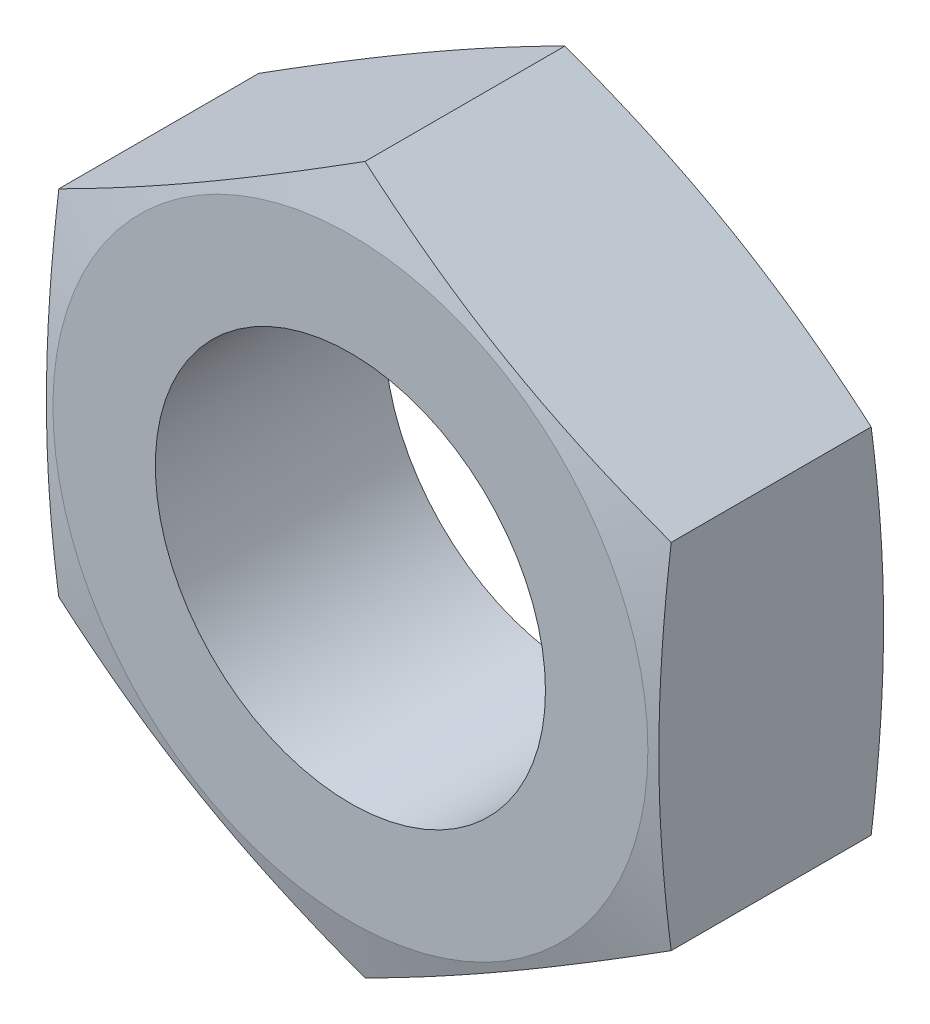
ISO-10303-21;
HEADER;
FILE_DESCRIPTION(('STEP AP214'),'2;1');
FILE_NAME('part.step','',(''),(''),'','','');
FILE_SCHEMA(('AUTOMOTIVE_DESIGN { 1 0 10303 214 1 1 1 1 }'));
ENDSEC;
DATA;
#1=APPLICATION_CONTEXT('core data for automotive mechanical design processes');
#2=APPLICATION_PROTOCOL_DEFINITION('international standard','automotive_design',2000,#1);
#3=PRODUCT_CONTEXT('',#1,'mechanical');
#4=PRODUCT('Part','Part','',(#3));
#5=PRODUCT_RELATED_PRODUCT_CATEGORY('part','',(#4));
#6=PRODUCT_DEFINITION_FORMATION('','',#4);
#7=PRODUCT_DEFINITION_CONTEXT('part definition',#1,'design');
#8=PRODUCT_DEFINITION('design','',#6,#7);
#9=PRODUCT_DEFINITION_SHAPE('','',#8);
#10=(LENGTH_UNIT() NAMED_UNIT(*) SI_UNIT(.MILLI.,.METRE.));
#11=(NAMED_UNIT(*) PLANE_ANGLE_UNIT() SI_UNIT($,.RADIAN.));
#12=(NAMED_UNIT(*) SI_UNIT($,.STERADIAN.) SOLID_ANGLE_UNIT());
#13=UNCERTAINTY_MEASURE_WITH_UNIT(LENGTH_MEASURE(1.E-05),#10,'distance_accuracy_value','');
#14=(GEOMETRIC_REPRESENTATION_CONTEXT(3) GLOBAL_UNCERTAINTY_ASSIGNED_CONTEXT((#13)) GLOBAL_UNIT_ASSIGNED_CONTEXT((#10,
#11,#12)) REPRESENTATION_CONTEXT('',''));
#15=CARTESIAN_POINT('',(0.,0.,0.));
#16=DIRECTION('',(0.,0.,1.));
#17=DIRECTION('',(1.,0.,0.));
#18=AXIS2_PLACEMENT_3D('',#15,#16,#17);
#19=CARTESIAN_POINT('',(0.,0.,-0.3));
#20=DIRECTION('',(0.,0.,-1.));
#21=DIRECTION('',(-1.,0.,0.));
#22=AXIS2_PLACEMENT_3D('',#19,#20,#21);
#23=CONICAL_SURFACE('',#22,7.25,1.31561393617408);
#24=CARTESIAN_POINT('',(0.,0.,0.));
#25=DIRECTION('',(0.,0.,1.));
#26=DIRECTION('',(1.,0.,0.));
#27=AXIS2_PLACEMENT_3D('',#24,#25,#26);
#28=CIRCLE('',#27,6.1);
#29=CARTESIAN_POINT('',(6.1,0.,0.));
#30=VERTEX_POINT('',#29);
#31=EDGE_CURVE('E214',#30,#30,#28,.T.);
#32=ORIENTED_EDGE('',*,*,#31,.F.);
#33=EDGE_LOOP('',(#32));
#34=FACE_BOUND('',#33,.T.);
#35=CARTESIAN_POINT('',(-0.0002,7.25011547005384,-0.300030123342369));
#36=CARTESIAN_POINT('',(0.260599655821666,7.09954271856064,-0.26073342817));
#37=CARTESIAN_POINT('',(0.521847916113624,6.94871096515576,-0.225062996490111));
#38=CARTESIAN_POINT('',(1.04521907229337,6.6465424872493,-0.162398748457734));
#39=CARTESIAN_POINT('',(1.30734226508088,6.49520559133259,-0.135408263534045));
#40=CARTESIAN_POINT('',(1.83095613749682,6.19289698114183,-0.0916676265620827));
#41=CARTESIAN_POINT('',(2.09244363443016,6.04192710439764,-0.0748680045735744));
#42=CARTESIAN_POINT('',(2.61573482819259,5.73980479281435,-0.0523418352924317));
#43=CARTESIAN_POINT('',(2.87753845845558,5.58865239640719,-0.0466132636792695));
#44=CARTESIAN_POINT('',(3.40114571898156,5.28634760359288,-0.0466132636792696));
#45=CARTESIAN_POINT('',(3.66294934924455,5.13519520718572,-0.0523418352924318));
#46=CARTESIAN_POINT('',(4.18624054300698,4.83307289560243,-0.0748680045735745));
#47=CARTESIAN_POINT('',(4.44772803994032,4.68210301885824,-0.0916676265620826));
#48=CARTESIAN_POINT('',(4.97134191235626,4.37979440866748,-0.135408263534045));
#49=CARTESIAN_POINT('',(5.23346510514377,4.22845751275077,-0.162398748457734));
#50=CARTESIAN_POINT('',(5.75683626132351,3.92628903484431,-0.225062996490111));
#51=CARTESIAN_POINT('',(6.01808452161547,3.77545728143943,-0.26073342817));
#52=CARTESIAN_POINT('',(6.27888417743714,3.62488452994623,-0.300030123342369));
#53=B_SPLINE_CURVE_WITH_KNOTS('',3,(#35,#36,#37,#38,#39,#40,#41,#42,#43,#44,#45,#46,#47,#48,#49,
#50,#51,#52),.UNSPECIFIED.,.F.,.F.,(4,2,2,2,2,2,2,2,4),(0.,0.911140879061937,1.82263104463789,
2.7296603584656,3.63652380800932,4.54338725755305,5.45041657138076,6.36190673695671,
7.27304761601864),.UNSPECIFIED.);
#54=CARTESIAN_POINT('',(0.,7.25,-0.3));
#55=VERTEX_POINT('',#54);
#56=CARTESIAN_POINT('',(6.27868417743714,3.62500000000007,-0.3));
#57=VERTEX_POINT('',#56);
#58=EDGE_CURVE('E163',#55,#57,#53,.T.);
#59=ORIENTED_EDGE('',*,*,#58,.F.);
#60=CARTESIAN_POINT('',(-6.27888417743719,3.62488452994615,-0.300030123342369));
#61=CARTESIAN_POINT('',(-6.01808452161552,3.77545728143935,-0.260733428169999));
#62=CARTESIAN_POINT('',(-5.75683626132356,3.92628903484423,-0.225062996490109));
#63=CARTESIAN_POINT('',(-5.23346510514381,4.2284575127507,-0.16239874845773));
#64=CARTESIAN_POINT('',(-4.97134191235629,4.37979440866741,-0.135408263534041));
#65=CARTESIAN_POINT('',(-4.44772803994035,4.68210301885818,-0.0916676265620771));
#66=CARTESIAN_POINT('',(-4.18624054300701,4.83307289560237,-0.0748680045735684));
#67=CARTESIAN_POINT('',(-3.66294934924458,5.13519520718567,-0.0523418352924252));
#68=CARTESIAN_POINT('',(-3.40114571898159,5.28634760359283,-0.0466132636792629));
#69=CARTESIAN_POINT('',(-2.8775384584556,5.58865239640715,-0.0466132636792629));
#70=CARTESIAN_POINT('',(-2.61573482819261,5.73980479281431,-0.0523418352924252));
#71=CARTESIAN_POINT('',(-2.09244363443018,6.04192710439761,-0.0748680045735685));
#72=CARTESIAN_POINT('',(-1.83095613749684,6.1928969811418,-0.0916676265620773));
#73=CARTESIAN_POINT('',(-1.30734226508089,6.49520559133257,-0.135408263534041));
#74=CARTESIAN_POINT('',(-1.04521907229338,6.64654248724928,-0.16239874845773));
#75=CARTESIAN_POINT('',(-0.521847916113628,6.94871096515575,-0.225062996490109));
#76=CARTESIAN_POINT('',(-0.260599655821667,7.09954271856064,-0.260733428169999));
#77=CARTESIAN_POINT('',(0.0002000000000007,7.25011547005384,-0.300030123342369));
#78=B_SPLINE_CURVE_WITH_KNOTS('',3,(#60,#61,#62,#63,#64,#65,#66,#67,#68,#69,#70,#71,#72,#73,#74,
#75,#76,#77),.UNSPECIFIED.,.F.,.F.,(4,2,2,2,2,2,2,2,4),(0.,0.911140879061948,1.82263104463791,
2.72966035846563,3.63652380800937,4.5433872575531,5.45041657138082,6.36190673695678,
7.27304761601873),.UNSPECIFIED.);
#79=CARTESIAN_POINT('',(-6.27868417743719,3.62499999999999,-0.3));
#80=VERTEX_POINT('',#79);
#81=EDGE_CURVE('E183',#80,#55,#78,.T.);
#82=ORIENTED_EDGE('',*,*,#81,.F.);
#83=CARTESIAN_POINT('',(-6.27868417743714,-9.57968471449994,-1.39667422304502));
#84=CARTESIAN_POINT('',(-6.27868417743714,-9.29492049546667,-1.33456023328671));
#85=CARTESIAN_POINT('',(-6.27868417743714,-9.00998673211827,-1.27320960556697));
#86=CARTESIAN_POINT('',(-6.27868417743715,-8.43969704656944,-1.15244637753268));
#87=CARTESIAN_POINT('',(-6.27868417743715,-8.15434110748845,-1.09303385702891));
#88=CARTESIAN_POINT('',(-6.27868417743715,-7.58288068713854,-0.976508936932167));
#89=CARTESIAN_POINT('',(-6.27868417743715,-7.2967757556802,-0.919398737290497));
#90=CARTESIAN_POINT('',(-6.27868417743715,-6.72399978272701,-0.808093124887488));
#91=CARTESIAN_POINT('',(-6.27868417743715,-6.43732874581246,-0.753897688642438));
#92=CARTESIAN_POINT('',(-6.27868417743715,-5.86548833634783,-0.649509387391201));
#93=CARTESIAN_POINT('',(-6.27868417743716,-5.58032393395201,-0.599289429745359));
#94=CARTESIAN_POINT('',(-6.27868417743716,-5.00925628704978,-0.503250433579618));
#95=CARTESIAN_POINT('',(-6.27868417743716,-4.72335305813381,-0.45743130296137));
#96=CARTESIAN_POINT('',(-6.27868417743716,-4.15075664848855,-0.371225713158916));
#97=CARTESIAN_POINT('',(-6.27868417743716,-3.86406356653093,-0.330838603595275));
#98=CARTESIAN_POINT('',(-6.27868417743716,-3.28981257862842,-0.256686046538901));
#99=CARTESIAN_POINT('',(-6.27868417743717,-3.0022546721012,-0.222920603505936));
#100=CARTESIAN_POINT('',(-6.27868417743717,-2.42321574118034,-0.16298349648432));
#101=CARTESIAN_POINT('',(-6.27868417743717,-2.13172574252884,-0.136897250887252));
#102=CARTESIAN_POINT('',(-6.27868417743717,-1.54805338407783,-0.0940824561010576));
#103=CARTESIAN_POINT('',(-6.27868417743717,-1.25587103927204,-0.0773537060890044));
#104=CARTESIAN_POINT('',(-6.27868417743717,-0.671214144218963,-0.0542225149928819));
#105=CARTESIAN_POINT('',(-6.27868417743717,-0.378739771336388,-0.0478156805840152));
#106=CARTESIAN_POINT('',(-6.27868417743718,0.206247942540443,-0.045719884396393));
#107=CARTESIAN_POINT('',(-6.27868417743718,0.498761283505629,-0.0500309146666452));
#108=CARTESIAN_POINT('',(-6.27868417743718,1.08444880067192,-0.0691288056040581));
#109=CARTESIAN_POINT('',(-6.27868417743718,1.37762177651092,-0.0839517458265011));
#110=CARTESIAN_POINT('',(-6.27868417743718,1.96331559039245,-0.123232156217014));
#111=CARTESIAN_POINT('',(-6.27868417743718,2.25583641487018,-0.147689824942164));
#112=CARTESIAN_POINT('',(-6.27868417743719,2.84022145140836,-0.205011617727857));
#113=CARTESIAN_POINT('',(-6.27868417743719,3.13208515134628,-0.237880883270297));
#114=CARTESIAN_POINT('',(-6.27868417743719,3.71492290050488,-0.310665893527223));
#115=CARTESIAN_POINT('',(-6.27868417743719,4.00589694703584,-0.350581659524324));
#116=CARTESIAN_POINT('',(-6.27868417743719,4.56802270321289,-0.433394250430127));
#117=CARTESIAN_POINT('',(-6.27868417743719,4.83922867067743,-0.475926477752999));
#118=CARTESIAN_POINT('',(-6.27868417743719,5.38096168617856,-0.565133949201941));
#119=CARTESIAN_POINT('',(-6.27868417743719,5.65148871639279,-0.611809300940714));
#120=CARTESIAN_POINT('',(-6.2786841774372,6.19195751311867,-0.708546762686245));
#121=CARTESIAN_POINT('',(-6.2786841774372,6.46189922756314,-0.758609162184579));
#122=CARTESIAN_POINT('',(-6.2786841774372,7.00125554242759,-0.861503745560772));
#123=CARTESIAN_POINT('',(-6.2786841774372,7.27067013629306,-0.914335963655884));
#124=CARTESIAN_POINT('',(-6.2786841774372,8.07835365883535,-1.07623565641602));
#125=CARTESIAN_POINT('',(-6.27868417743721,8.61594408807842,-1.18868452047896));
#126=CARTESIAN_POINT('',(-6.27868417743721,9.68976451220727,-1.41969659496458));
#127=CARTESIAN_POINT('',(-6.27868417743721,10.2259945811007,-1.53825946494366));
#128=CARTESIAN_POINT('',(-6.27868417743721,11.2924787166159,-1.77856596810744));
#129=CARTESIAN_POINT('',(-6.27868417743722,11.8227418300243,-1.90026956245141));
#130=CARTESIAN_POINT('',(-6.27868417743722,12.8825637202876,-2.14673768604401));
#131=CARTESIAN_POINT('',(-6.27868417743722,13.4121224847507,-2.27150226841345));
#132=CARTESIAN_POINT('',(-6.27868417743723,14.4700741875796,-2.52314381190501));
#133=CARTESIAN_POINT('',(-6.27868417743723,14.9984677638913,-2.65001809632836));
#134=CARTESIAN_POINT('',(-6.27868417743723,16.0548167474188,-2.90550674831498));
#135=CARTESIAN_POINT('',(-6.27868417743723,16.5827721679116,-3.034121060944));
#136=CARTESIAN_POINT('',(-6.27868417743723,17.1105749180527,-3.16335138760524));
#137=B_SPLINE_CURVE_WITH_KNOTS('',3,(#83,#84,#85,#86,#87,#88,#89,#90,#91,#92,#93,#94,#95,#96,
#97,#98,#99,#100,#101,#102,#103,#104,#105,#106,#107,#108,#109,#110,#111,#112,#113,#114,#115,
#116,#117,#118,#119,#120,#121,#122,#123,#124,#125,#126,#127,#128,#129,#130,#131,#132,#133,#134,
#135,#136),.UNSPECIFIED.,.F.,.F.,(4,2,2,2,2,2,2,2,2,2,2,2,2,2,2,2,2,2,2,2,2,2,2,2,2,2,4),(0.,
0.874382760097262,1.74880148173107,2.62403684136477,3.4992651483318,4.36789578633289,
5.23650824209519,6.10501660556329,6.97352555397973,7.85135878497576,8.72917317590906,
9.6066138432326,10.4840538596315,11.3645201413252,12.2450045690373,13.1260284725174,
14.0070550370084,14.8305795997671,15.6541255588544,16.477741995701,17.3013686095807,
18.9489824020232,20.5965045499468,22.2286426247064,23.8608090438789,25.4910424761681,
27.1212245600734),.UNSPECIFIED.);
#138=CARTESIAN_POINT('',(-6.27868417743716,-3.62500000000003,-0.3));
#139=VERTEX_POINT('',#138);
#140=EDGE_CURVE('E102',#139,#80,#137,.T.);
#141=ORIENTED_EDGE('',*,*,#140,.F.);
#142=CARTESIAN_POINT('',(0.000200000000050626,-7.25011547005384,-0.300030123342369));
#143=CARTESIAN_POINT('',(-0.260599655821618,-7.09954271856064,-0.260733428169999));
#144=CARTESIAN_POINT('',(-0.52184791611358,-6.94871096515575,-0.225062996490109));
#145=CARTESIAN_POINT('',(-1.04521907229333,-6.64654248724929,-0.16239874845773));
#146=CARTESIAN_POINT('',(-1.30734226508085,-6.49520559133258,-0.135408263534041));
#147=CARTESIAN_POINT('',(-1.83095613749679,-6.19289698114181,-0.0916676265620772));
#148=CARTESIAN_POINT('',(-2.09244363443013,-6.04192710439763,-0.0748680045735685));
#149=CARTESIAN_POINT('',(-2.61573482819257,-5.73980479281433,-0.0523418352924254));
#150=CARTESIAN_POINT('',(-2.87753845845556,-5.58865239640717,-0.0466132636792631));
#151=CARTESIAN_POINT('',(-3.40114571898155,-5.28634760359286,-0.0466132636792631));
#152=CARTESIAN_POINT('',(-3.66294934924454,-5.1351952071857,-0.0523418352924253));
#153=CARTESIAN_POINT('',(-4.18624054300698,-4.8330728956024,-0.0748680045735684));
#154=CARTESIAN_POINT('',(-4.44772803994032,-4.68210301885821,-0.0916676265620771));
#155=CARTESIAN_POINT('',(-4.97134191235626,-4.37979440866745,-0.135408263534041));
#156=CARTESIAN_POINT('',(-5.23346510514378,-4.22845751275074,-0.16239874845773));
#157=CARTESIAN_POINT('',(-5.75683626132353,-3.92628903484427,-0.225062996490109));
#158=CARTESIAN_POINT('',(-6.01808452161549,-3.77545728143939,-0.260733428169999));
#159=CARTESIAN_POINT('',(-6.27888417743716,-3.62488452994619,-0.300030123342369));
#160=B_SPLINE_CURVE_WITH_KNOTS('',3,(#142,#143,#144,#145,#146,#147,#148,#149,#150,#151,#152,
#153,#154,#155,#156,#157,#158,#159),.UNSPECIFIED.,.F.,.F.,(4,2,2,2,2,2,2,2,4),(0.,
0.911140879061947,1.82263104463791,2.72966035846563,3.63652380800936,4.5433872575531,
5.45041657138082,6.36190673695678,7.27304761601873),.UNSPECIFIED.);
#161=CARTESIAN_POINT('',(0.,-7.25,-0.3));
#162=VERTEX_POINT('',#161);
#163=EDGE_CURVE('E193',#162,#139,#160,.T.);
#164=ORIENTED_EDGE('',*,*,#163,.F.);
#165=CARTESIAN_POINT('',(6.27888417743721,-3.6248845299461,-0.300030123342369));
#166=CARTESIAN_POINT('',(6.01808452161555,-3.77545728143931,-0.260733428169999));
#167=CARTESIAN_POINT('',(5.75683626132359,-3.92628903484419,-0.225062996490109));
#168=CARTESIAN_POINT('',(5.23346510514384,-4.22845751275066,-0.16239874845773));
#169=CARTESIAN_POINT('',(4.97134191235633,-4.37979440866738,-0.135408263534041));
#170=CARTESIAN_POINT('',(4.44772803994038,-4.68210301885815,-0.0916676265620772));
#171=CARTESIAN_POINT('',(4.18624054300705,-4.83307289560234,-0.0748680045735686));
#172=CARTESIAN_POINT('',(3.66294934924461,-5.13519520718565,-0.0523418352924253));
#173=CARTESIAN_POINT('',(3.40114571898162,-5.28634760359281,-0.0466132636792629));
#174=CARTESIAN_POINT('',(2.87753845845564,-5.58865239640713,-0.0466132636792629));
#175=CARTESIAN_POINT('',(2.61573482819265,-5.73980479281429,-0.0523418352924253));
#176=CARTESIAN_POINT('',(2.09244363443022,-6.0419271043976,-0.0748680045735686));
#177=CARTESIAN_POINT('',(1.83095613749688,-6.19289698114179,-0.0916676265620772));
#178=CARTESIAN_POINT('',(1.30734226508094,-6.49520559133256,-0.135408263534041));
#179=CARTESIAN_POINT('',(1.04521907229342,-6.64654248724928,-0.16239874845773));
#180=CARTESIAN_POINT('',(0.521847916113676,-6.94871096515575,-0.225062996490109));
#181=CARTESIAN_POINT('',(0.260599655821717,-7.09954271856063,-0.26073342817));
#182=CARTESIAN_POINT('',(-0.000199999999949827,-7.25011547005384,-0.300030123342369));
#183=B_SPLINE_CURVE_WITH_KNOTS('',3,(#165,#166,#167,#168,#169,#170,#171,#172,#173,#174,#175,
#176,#177,#178,#179,#180,#181,#182),.UNSPECIFIED.,.F.,.F.,(4,2,2,2,2,2,2,2,4),(0.,
0.911140879061946,1.82263104463791,2.72966035846563,3.63652380800937,4.5433872575531,
5.45041657138082,6.36190673695678,7.27304761601873),.UNSPECIFIED.);
#184=CARTESIAN_POINT('',(6.27868417743721,-3.62499999999994,-0.3));
#185=VERTEX_POINT('',#184);
#186=EDGE_CURVE('E164',#185,#162,#183,.T.);
#187=ORIENTED_EDGE('',*,*,#186,.F.);
#188=CARTESIAN_POINT('',(6.27868417743728,-9.57968471449985,-1.39667422304502));
#189=CARTESIAN_POINT('',(6.27868417743727,-9.29492049546658,-1.33456023328671));
#190=CARTESIAN_POINT('',(6.27868417743727,-9.00998673211819,-1.27320960556698));
#191=CARTESIAN_POINT('',(6.27868417743727,-8.43969704656935,-1.15244637753268));
#192=CARTESIAN_POINT('',(6.27868417743726,-8.15434110748836,-1.09303385702891));
#193=CARTESIAN_POINT('',(6.27868417743726,-7.58288068713845,-0.976508936932168));
#194=CARTESIAN_POINT('',(6.27868417743725,-7.29677575568012,-0.919398737290497));
#195=CARTESIAN_POINT('',(6.27868417743725,-6.72399978272693,-0.808093124887488));
#196=CARTESIAN_POINT('',(6.27868417743724,-6.43732874581237,-0.753897688642438));
#197=CARTESIAN_POINT('',(6.27868417743724,-5.86548833634774,-0.649509387391201));
#198=CARTESIAN_POINT('',(6.27868417743723,-5.58032393395192,-0.599289429745358));
#199=CARTESIAN_POINT('',(6.27868417743723,-5.00925628704969,-0.503250433579618));
#200=CARTESIAN_POINT('',(6.27868417743723,-4.72335305813372,-0.45743130296137));
#201=CARTESIAN_POINT('',(6.27868417743722,-4.15075664848846,-0.371225713158916));
#202=CARTESIAN_POINT('',(6.27868417743722,-3.86406356653084,-0.330838603595275));
#203=CARTESIAN_POINT('',(6.27868417743721,-3.28981257862833,-0.256686046538901));
#204=CARTESIAN_POINT('',(6.27868417743721,-3.00225467210111,-0.222920603505936));
#205=CARTESIAN_POINT('',(6.2786841774372,-2.42321574118025,-0.16298349648432));
#206=CARTESIAN_POINT('',(6.2786841774372,-2.13172574252875,-0.136897250887252));
#207=CARTESIAN_POINT('',(6.27868417743719,-1.54805338407774,-0.0940824561010578));
#208=CARTESIAN_POINT('',(6.27868417743719,-1.25587103927196,-0.0773537060890044));
#209=CARTESIAN_POINT('',(6.27868417743718,-0.671214144218877,-0.0542225149928819));
#210=CARTESIAN_POINT('',(6.27868417743718,-0.378739771336302,-0.0478156805840154));
#211=CARTESIAN_POINT('',(6.27868417743717,0.206247942540529,-0.0457198843963932));
#212=CARTESIAN_POINT('',(6.27868417743717,0.498761283505715,-0.0500309146666454));
#213=CARTESIAN_POINT('',(6.27868417743716,1.08444880067201,-0.0691288056040583));
#214=CARTESIAN_POINT('',(6.27868417743716,1.37762177651101,-0.0839517458265013));
#215=CARTESIAN_POINT('',(6.27868417743716,1.96331559039254,-0.123232156217014));
#216=CARTESIAN_POINT('',(6.27868417743715,2.25583641487027,-0.147689824942164));
#217=CARTESIAN_POINT('',(6.27868417743715,2.84022145140845,-0.205011617727857));
#218=CARTESIAN_POINT('',(6.27868417743714,3.13208515134637,-0.237880883270297));
#219=CARTESIAN_POINT('',(6.27868417743714,3.71492290050497,-0.310665893527223));
#220=CARTESIAN_POINT('',(6.27868417743713,4.00589694703593,-0.350581659524324));
#221=CARTESIAN_POINT('',(6.27868417743713,4.56802270321298,-0.433394250430127));
#222=CARTESIAN_POINT('',(6.27868417743712,4.83922867067752,-0.475926477753));
#223=CARTESIAN_POINT('',(6.27868417743712,5.38096168617865,-0.565133949201942));
#224=CARTESIAN_POINT('',(6.27868417743712,5.65148871639288,-0.611809300940715));
#225=CARTESIAN_POINT('',(6.27868417743711,6.19195751311876,-0.708546762686246));
#226=CARTESIAN_POINT('',(6.27868417743711,6.46189922756323,-0.75860916218458));
#227=CARTESIAN_POINT('',(6.2786841774371,7.00125554242768,-0.861503745560772));
#228=CARTESIAN_POINT('',(6.2786841774371,7.27067013629315,-0.914335963655885));
#229=CARTESIAN_POINT('',(6.27868417743709,8.07835365883544,-1.07623565641602));
#230=CARTESIAN_POINT('',(6.27868417743708,8.61594408807851,-1.18868452047897));
#231=CARTESIAN_POINT('',(6.27868417743707,9.68976451220736,-1.41969659496458));
#232=CARTESIAN_POINT('',(6.27868417743707,10.2259945811008,-1.53825946494367));
#233=CARTESIAN_POINT('',(6.27868417743706,11.292478716616,-1.77856596810745));
#234=CARTESIAN_POINT('',(6.27868417743705,11.8227418300244,-1.90026956245141));
#235=CARTESIAN_POINT('',(6.27868417743704,12.8825637202877,-2.14673768604401));
#236=CARTESIAN_POINT('',(6.27868417743703,13.4121224847508,-2.27150226841345));
#237=CARTESIAN_POINT('',(6.27868417743702,14.4700741875797,-2.52314381190501));
#238=CARTESIAN_POINT('',(6.27868417743702,14.9984677638914,-2.65001809632836));
#239=CARTESIAN_POINT('',(6.27868417743701,16.0548167474189,-2.90550674831498));
#240=CARTESIAN_POINT('',(6.278684177437,16.5827721679117,-3.034121060944));
#241=CARTESIAN_POINT('',(6.278684177437,17.1105749180528,-3.16335138760524));
#242=B_SPLINE_CURVE_WITH_KNOTS('',3,(#188,#189,#190,#191,#192,#193,#194,#195,#196,#197,#198,
#199,#200,#201,#202,#203,#204,#205,#206,#207,#208,#209,#210,#211,#212,#213,#214,#215,#216,#217,
#218,#219,#220,#221,#222,#223,#224,#225,#226,#227,#228,#229,#230,#231,#232,#233,#234,#235,#236,
#237,#238,#239,#240,#241),.UNSPECIFIED.,.F.,.F.,(4,2,2,2,2,2,2,2,2,2,2,2,2,2,2,2,2,2,2,2,2,2,2,
2,2,2,4),(0.,0.874382760097262,1.74880148173107,2.62403684136477,3.4992651483318,
4.3678957863329,5.23650824209519,6.10501660556329,6.97352555397973,7.85135878497577,
8.72917317590906,9.6066138432326,10.4840538596315,11.3645201413252,12.2450045690373,
13.1260284725174,14.0070550370084,14.8305795997671,15.6541255588544,16.477741995701,
17.3013686095807,18.9489824020232,20.5965045499468,22.2286426247064,23.8608090438789,
25.4910424761681,27.1212245600734),.UNSPECIFIED.);
#243=EDGE_CURVE('E157',#57,#185,#242,.F.);
#244=ORIENTED_EDGE('',*,*,#243,.F.);
#245=EDGE_LOOP('',(#59,#82,#141,#164,#187,#244));
#246=FACE_BOUND('',#245,.T.);
#247=ADVANCED_FACE('F35',(#34,#246),#23,.T.);
#248=CARTESIAN_POINT('',(0.,0.,-4.7));
#249=DIRECTION('',(0.,0.,1.));
#250=DIRECTION('',(1.,0.,0.));
#251=AXIS2_PLACEMENT_3D('',#248,#249,#250);
#252=CONICAL_SURFACE('',#251,6.1,1.31561393617408);
#253=CARTESIAN_POINT('',(0.,0.,-4.7));
#254=DIRECTION('',(0.,0.,1.));
#255=DIRECTION('',(1.,0.,0.));
#256=AXIS2_PLACEMENT_3D('',#253,#254,#255);
#257=CIRCLE('',#256,6.1);
#258=CARTESIAN_POINT('',(6.1,0.,-4.7));
#259=VERTEX_POINT('',#258);
#260=EDGE_CURVE('E233',#259,#259,#257,.T.);
#261=ORIENTED_EDGE('',*,*,#260,.T.);
#262=EDGE_LOOP('',(#261));
#263=FACE_BOUND('',#262,.T.);
#264=CARTESIAN_POINT('',(6.27888417743714,3.62488452994624,-4.39996987665763));
#265=CARTESIAN_POINT('',(6.01808452161547,3.77545728143943,-4.43926657183));
#266=CARTESIAN_POINT('',(5.75683626132351,3.92628903484431,-4.47493700350989));
#267=CARTESIAN_POINT('',(5.23346510514377,4.22845751275077,-4.53760125154227));
#268=CARTESIAN_POINT('',(4.97134191235626,4.37979440866748,-4.56459173646596));
#269=CARTESIAN_POINT('',(4.44772803994032,4.68210301885825,-4.60833237343792));
#270=CARTESIAN_POINT('',(4.18624054300698,4.83307289560243,-4.62513199542643));
#271=CARTESIAN_POINT('',(3.66294934924455,5.13519520718572,-4.64765816470757));
#272=CARTESIAN_POINT('',(3.40114571898156,5.28634760359288,-4.65338673632073));
#273=CARTESIAN_POINT('',(2.87753845845558,5.58865239640719,-4.65338673632073));
#274=CARTESIAN_POINT('',(2.61573482819259,5.73980479281435,-4.64765816470757));
#275=CARTESIAN_POINT('',(2.09244363443016,6.04192710439764,-4.62513199542643));
#276=CARTESIAN_POINT('',(1.83095613749682,6.19289698114183,-4.60833237343792));
#277=CARTESIAN_POINT('',(1.30734226508088,6.49520559133259,-4.56459173646595));
#278=CARTESIAN_POINT('',(1.04521907229337,6.6465424872493,-4.53760125154227));
#279=CARTESIAN_POINT('',(0.521847916113624,6.94871096515576,-4.47493700350989));
#280=CARTESIAN_POINT('',(0.260599655821666,7.09954271856064,-4.43926657183));
#281=CARTESIAN_POINT('',(-0.000199999999999651,7.25011547005384,-4.39996987665763));
#282=B_SPLINE_CURVE_WITH_KNOTS('',3,(#264,#265,#266,#267,#268,#269,#270,#271,#272,#273,#274,
#275,#276,#277,#278,#279,#280,#281),.UNSPECIFIED.,.F.,.F.,(4,2,2,2,2,2,2,2,4),(0.,
0.911140879061935,1.82263104463788,2.7296603584656,3.63652380800932,4.54338725755304,
5.45041657138076,6.3619067369567,7.27304761601864),.UNSPECIFIED.);
#283=CARTESIAN_POINT('',(6.27868417743714,3.62500000000007,-4.4));
#284=VERTEX_POINT('',#283);
#285=CARTESIAN_POINT('',(0.,7.25,-4.4));
#286=VERTEX_POINT('',#285);
#287=EDGE_CURVE('E12',#284,#286,#282,.T.);
#288=ORIENTED_EDGE('',*,*,#287,.F.);
#289=CARTESIAN_POINT('',(6.27868417743728,-9.57968471449985,-3.30332577695498));
#290=CARTESIAN_POINT('',(6.27868417743727,-9.29492049546658,-3.36543976671329));
#291=CARTESIAN_POINT('',(6.27868417743727,-9.00998673211819,-3.42679039443303));
#292=CARTESIAN_POINT('',(6.27868417743727,-8.43969704656935,-3.54755362246733));
#293=CARTESIAN_POINT('',(6.27868417743726,-8.15434110748836,-3.60696614297109));
#294=CARTESIAN_POINT('',(6.27868417743726,-7.58288068713845,-3.72349106306783));
#295=CARTESIAN_POINT('',(6.27868417743725,-7.29677575568012,-3.78060126270951));
#296=CARTESIAN_POINT('',(6.27868417743725,-6.72399978272693,-3.89190687511251));
#297=CARTESIAN_POINT('',(6.27868417743724,-6.43732874581237,-3.94610231135756));
#298=CARTESIAN_POINT('',(6.27868417743724,-5.86548833634774,-4.0504906126088));
#299=CARTESIAN_POINT('',(6.27868417743723,-5.58032393395192,-4.10071057025464));
#300=CARTESIAN_POINT('',(6.27868417743723,-5.00925628704969,-4.19674956642038));
#301=CARTESIAN_POINT('',(6.27868417743723,-4.72335305813372,-4.24256869703863));
#302=CARTESIAN_POINT('',(6.27868417743722,-4.15075664848846,-4.32877428684108));
#303=CARTESIAN_POINT('',(6.27868417743722,-3.86406356653084,-4.36916139640473));
#304=CARTESIAN_POINT('',(6.27868417743721,-3.28981257862833,-4.4433139534611));
#305=CARTESIAN_POINT('',(6.27868417743721,-3.00225467210111,-4.47707939649406));
#306=CARTESIAN_POINT('',(6.2786841774372,-2.42321574118025,-4.53701650351568));
#307=CARTESIAN_POINT('',(6.2786841774372,-2.13172574252875,-4.56310274911275));
#308=CARTESIAN_POINT('',(6.27868417743719,-1.54805338407774,-4.60591754389894));
#309=CARTESIAN_POINT('',(6.27868417743719,-1.25587103927196,-4.622646293911));
#310=CARTESIAN_POINT('',(6.27868417743718,-0.671214144218877,-4.64577748500712));
#311=CARTESIAN_POINT('',(6.27868417743718,-0.378739771336302,-4.65218431941598));
#312=CARTESIAN_POINT('',(6.27868417743717,0.206247942540529,-4.65428011560361));
#313=CARTESIAN_POINT('',(6.27868417743717,0.498761283505714,-4.64996908533335));
#314=CARTESIAN_POINT('',(6.27868417743716,1.08444880067201,-4.63087119439594));
#315=CARTESIAN_POINT('',(6.27868417743716,1.37762177651101,-4.6160482541735));
#316=CARTESIAN_POINT('',(6.27868417743716,1.96331559039254,-4.57676784378299));
#317=CARTESIAN_POINT('',(6.27868417743715,2.25583641487027,-4.55231017505784));
#318=CARTESIAN_POINT('',(6.27868417743715,2.84022145140845,-4.49498838227214));
#319=CARTESIAN_POINT('',(6.27868417743714,3.13208515134636,-4.4621191167297));
#320=CARTESIAN_POINT('',(6.27868417743714,3.71492290050497,-4.38933410647278));
#321=CARTESIAN_POINT('',(6.27868417743713,4.00589694703593,-4.34941834047568));
#322=CARTESIAN_POINT('',(6.27868417743713,4.56802270321298,-4.26660574956987));
#323=CARTESIAN_POINT('',(6.27868417743712,4.83922867067752,-4.224073522247));
#324=CARTESIAN_POINT('',(6.27868417743712,5.38096168617865,-4.13486605079806));
#325=CARTESIAN_POINT('',(6.27868417743712,5.65148871639288,-4.08819069905929));
#326=CARTESIAN_POINT('',(6.27868417743711,6.19195751311876,-3.99145323731375));
#327=CARTESIAN_POINT('',(6.27868417743711,6.46189922756323,-3.94139083781542));
#328=CARTESIAN_POINT('',(6.2786841774371,7.00125554242768,-3.83849625443923));
#329=CARTESIAN_POINT('',(6.2786841774371,7.27067013629315,-3.78566403634412));
#330=CARTESIAN_POINT('',(6.27868417743709,8.07835365883545,-3.62376434358398));
#331=CARTESIAN_POINT('',(6.27868417743708,8.61594408807851,-3.51131547952104));
#332=CARTESIAN_POINT('',(6.27868417743707,9.68976451220736,-3.28030340503542));
#333=CARTESIAN_POINT('',(6.27868417743707,10.2259945811008,-3.16174053505634));
#334=CARTESIAN_POINT('',(6.27868417743706,11.292478716616,-2.92143403189256));
#335=CARTESIAN_POINT('',(6.27868417743705,11.8227418300244,-2.79973043754859));
#336=CARTESIAN_POINT('',(6.27868417743704,12.8825637202877,-2.55326231395599));
#337=CARTESIAN_POINT('',(6.27868417743703,13.4121224847508,-2.42849773158655));
#338=CARTESIAN_POINT('',(6.27868417743702,14.4700741875797,-2.17685618809499));
#339=CARTESIAN_POINT('',(6.27868417743702,14.9984677638914,-2.04998190367164));
#340=CARTESIAN_POINT('',(6.27868417743701,16.0548167474189,-1.79449325168502));
#341=CARTESIAN_POINT('',(6.278684177437,16.5827721679117,-1.66587893905601));
#342=CARTESIAN_POINT('',(6.278684177437,17.1105749180528,-1.53664861239477));
#343=B_SPLINE_CURVE_WITH_KNOTS('',3,(#289,#290,#291,#292,#293,#294,#295,#296,#297,#298,#299,
#300,#301,#302,#303,#304,#305,#306,#307,#308,#309,#310,#311,#312,#313,#314,#315,#316,#317,#318,
#319,#320,#321,#322,#323,#324,#325,#326,#327,#328,#329,#330,#331,#332,#333,#334,#335,#336,#337,
#338,#339,#340,#341,#342),.UNSPECIFIED.,.F.,.F.,(4,2,2,2,2,2,2,2,2,2,2,2,2,2,2,2,2,2,2,2,2,2,2,
2,2,2,4),(0.,0.874382760097262,1.74880148173107,2.62403684136477,3.4992651483318,
4.3678957863329,5.23650824209519,6.10501660556329,6.97352555397974,7.85135878497577,
8.72917317590906,9.6066138432326,10.4840538596315,11.3645201413252,12.2450045690373,
13.1260284725174,14.0070550370084,14.8305795997671,15.6541255588544,16.477741995701,
17.3013686095807,18.9489824020232,20.5965045499468,22.2286426247064,23.8608090438789,
25.4910424761681,27.1212245600734),.UNSPECIFIED.);
#344=CARTESIAN_POINT('',(6.27868417743721,-3.62499999999994,-4.4));
#345=VERTEX_POINT('',#344);
#346=EDGE_CURVE('E48',#345,#284,#343,.T.);
#347=ORIENTED_EDGE('',*,*,#346,.F.);
#348=CARTESIAN_POINT('',(-0.000199999999949461,-7.25011547005384,-4.39996987665763));
#349=CARTESIAN_POINT('',(0.260599655821718,-7.09954271856063,-4.43926657183));
#350=CARTESIAN_POINT('',(0.521847916113677,-6.94871096515575,-4.47493700350989));
#351=CARTESIAN_POINT('',(1.04521907229343,-6.64654248724928,-4.53760125154227));
#352=CARTESIAN_POINT('',(1.30734226508094,-6.49520559133256,-4.56459173646596));
#353=CARTESIAN_POINT('',(1.83095613749688,-6.19289698114179,-4.60833237343792));
#354=CARTESIAN_POINT('',(2.09244363443022,-6.0419271043976,-4.62513199542643));
#355=CARTESIAN_POINT('',(2.61573482819265,-5.73980479281429,-4.64765816470757));
#356=CARTESIAN_POINT('',(2.87753845845564,-5.58865239640713,-4.65338673632074));
#357=CARTESIAN_POINT('',(3.40114571898162,-5.28634760359281,-4.65338673632074));
#358=CARTESIAN_POINT('',(3.66294934924461,-5.13519520718565,-4.64765816470757));
#359=CARTESIAN_POINT('',(4.18624054300705,-4.83307289560234,-4.62513199542643));
#360=CARTESIAN_POINT('',(4.44772803994039,-4.68210301885815,-4.60833237343792));
#361=CARTESIAN_POINT('',(4.97134191235633,-4.37979440866738,-4.56459173646596));
#362=CARTESIAN_POINT('',(5.23346510514384,-4.22845751275066,-4.53760125154227));
#363=CARTESIAN_POINT('',(5.75683626132359,-3.92628903484419,-4.47493700350989));
#364=CARTESIAN_POINT('',(6.01808452161555,-3.77545728143931,-4.43926657183));
#365=CARTESIAN_POINT('',(6.27888417743721,-3.6248845299461,-4.39996987665763));
#366=B_SPLINE_CURVE_WITH_KNOTS('',3,(#348,#349,#350,#351,#352,#353,#354,#355,#356,#357,#358,
#359,#360,#361,#362,#363,#364,#365),.UNSPECIFIED.,.F.,.F.,(4,2,2,2,2,2,2,2,4),(0.,
0.911140879061948,1.82263104463791,2.72966035846563,3.63652380800937,4.5433872575531,
5.45041657138082,6.36190673695679,7.27304761601873),.UNSPECIFIED.);
#367=CARTESIAN_POINT('',(0.,-7.25,-4.4));
#368=VERTEX_POINT('',#367);
#369=EDGE_CURVE('E111',#368,#345,#366,.T.);
#370=ORIENTED_EDGE('',*,*,#369,.F.);
#371=CARTESIAN_POINT('',(-6.27888417743716,-3.62488452994619,-4.39996987665763));
#372=CARTESIAN_POINT('',(-6.01808452161549,-3.77545728143939,-4.43926657183));
#373=CARTESIAN_POINT('',(-5.75683626132353,-3.92628903484427,-4.47493700350989));
#374=CARTESIAN_POINT('',(-5.23346510514378,-4.22845751275074,-4.53760125154227));
#375=CARTESIAN_POINT('',(-4.97134191235626,-4.37979440866745,-4.56459173646596));
#376=CARTESIAN_POINT('',(-4.44772803994032,-4.68210301885821,-4.60833237343792));
#377=CARTESIAN_POINT('',(-4.18624054300698,-4.8330728956024,-4.62513199542643));
#378=CARTESIAN_POINT('',(-3.66294934924454,-5.1351952071857,-4.64765816470757));
#379=CARTESIAN_POINT('',(-3.40114571898155,-5.28634760359285,-4.65338673632074));
#380=CARTESIAN_POINT('',(-2.87753845845556,-5.58865239640717,-4.65338673632074));
#381=CARTESIAN_POINT('',(-2.61573482819257,-5.73980479281433,-4.64765816470757));
#382=CARTESIAN_POINT('',(-2.09244363443014,-6.04192710439763,-4.62513199542643));
#383=CARTESIAN_POINT('',(-1.83095613749679,-6.19289698114181,-4.60833237343792));
#384=CARTESIAN_POINT('',(-1.30734226508085,-6.49520559133258,-4.56459173646596));
#385=CARTESIAN_POINT('',(-1.04521907229333,-6.64654248724929,-4.53760125154227));
#386=CARTESIAN_POINT('',(-0.521847916113582,-6.94871096515575,-4.47493700350989));
#387=CARTESIAN_POINT('',(-0.26059965582162,-7.09954271856064,-4.43926657183));
#388=CARTESIAN_POINT('',(0.000200000000049295,-7.25011547005384,-4.39996987665763));
#389=B_SPLINE_CURVE_WITH_KNOTS('',3,(#371,#372,#373,#374,#375,#376,#377,#378,#379,#380,#381,
#382,#383,#384,#385,#386,#387,#388),.UNSPECIFIED.,.F.,.F.,(4,2,2,2,2,2,2,2,4),(0.,
0.911140879061946,1.82263104463791,2.72966035846563,3.63652380800936,4.5433872575531,
5.45041657138082,6.36190673695678,7.27304761601873),.UNSPECIFIED.);
#390=CARTESIAN_POINT('',(-6.27868417743716,-3.62500000000003,-4.4));
#391=VERTEX_POINT('',#390);
#392=EDGE_CURVE('E109',#391,#368,#389,.T.);
#393=ORIENTED_EDGE('',*,*,#392,.F.);
#394=CARTESIAN_POINT('',(-6.27868417743714,-9.57968471449994,-3.30332577695498));
#395=CARTESIAN_POINT('',(-6.27868417743714,-9.29492049546667,-3.36543976671329));
#396=CARTESIAN_POINT('',(-6.27868417743714,-9.00998673211827,-3.42679039443303));
#397=CARTESIAN_POINT('',(-6.27868417743715,-8.43969704656944,-3.54755362246733));
#398=CARTESIAN_POINT('',(-6.27868417743715,-8.15434110748845,-3.60696614297109));
#399=CARTESIAN_POINT('',(-6.27868417743715,-7.58288068713854,-3.72349106306783));
#400=CARTESIAN_POINT('',(-6.27868417743715,-7.2967757556802,-3.78060126270951));
#401=CARTESIAN_POINT('',(-6.27868417743715,-6.72399978272701,-3.89190687511251));
#402=CARTESIAN_POINT('',(-6.27868417743715,-6.43732874581246,-3.94610231135756));
#403=CARTESIAN_POINT('',(-6.27868417743715,-5.86548833634783,-4.0504906126088));
#404=CARTESIAN_POINT('',(-6.27868417743716,-5.58032393395201,-4.10071057025464));
#405=CARTESIAN_POINT('',(-6.27868417743716,-5.00925628704978,-4.19674956642038));
#406=CARTESIAN_POINT('',(-6.27868417743716,-4.72335305813381,-4.24256869703863));
#407=CARTESIAN_POINT('',(-6.27868417743716,-4.15075664848855,-4.32877428684109));
#408=CARTESIAN_POINT('',(-6.27868417743716,-3.86406356653093,-4.36916139640473));
#409=CARTESIAN_POINT('',(-6.27868417743716,-3.28981257862842,-4.4433139534611));
#410=CARTESIAN_POINT('',(-6.27868417743717,-3.0022546721012,-4.47707939649406));
#411=CARTESIAN_POINT('',(-6.27868417743717,-2.42321574118034,-4.53701650351568));
#412=CARTESIAN_POINT('',(-6.27868417743717,-2.13172574252884,-4.56310274911275));
#413=CARTESIAN_POINT('',(-6.27868417743717,-1.54805338407783,-4.60591754389894));
#414=CARTESIAN_POINT('',(-6.27868417743717,-1.25587103927204,-4.622646293911));
#415=CARTESIAN_POINT('',(-6.27868417743717,-0.671214144218965,-4.64577748500712));
#416=CARTESIAN_POINT('',(-6.27868417743717,-0.37873977133639,-4.65218431941599));
#417=CARTESIAN_POINT('',(-6.27868417743718,0.206247942540441,-4.65428011560361));
#418=CARTESIAN_POINT('',(-6.27868417743718,0.498761283505626,-4.64996908533336));
#419=CARTESIAN_POINT('',(-6.27868417743718,1.08444880067192,-4.63087119439594));
#420=CARTESIAN_POINT('',(-6.27868417743718,1.37762177651092,-4.6160482541735));
#421=CARTESIAN_POINT('',(-6.27868417743718,1.96331559039245,-4.57676784378299));
#422=CARTESIAN_POINT('',(-6.27868417743718,2.25583641487018,-4.55231017505784));
#423=CARTESIAN_POINT('',(-6.27868417743719,2.84022145140836,-4.49498838227214));
#424=CARTESIAN_POINT('',(-6.27868417743719,3.13208515134628,-4.4621191167297));
#425=CARTESIAN_POINT('',(-6.27868417743719,3.71492290050488,-4.38933410647278));
#426=CARTESIAN_POINT('',(-6.27868417743719,4.00589694703584,-4.34941834047568));
#427=CARTESIAN_POINT('',(-6.27868417743719,4.56802270321289,-4.26660574956987));
#428=CARTESIAN_POINT('',(-6.27868417743719,4.83922867067744,-4.224073522247));
#429=CARTESIAN_POINT('',(-6.27868417743719,5.38096168617856,-4.13486605079806));
#430=CARTESIAN_POINT('',(-6.27868417743719,5.65148871639279,-4.08819069905929));
#431=CARTESIAN_POINT('',(-6.2786841774372,6.19195751311867,-3.99145323731375));
#432=CARTESIAN_POINT('',(-6.2786841774372,6.46189922756314,-3.94139083781542));
#433=CARTESIAN_POINT('',(-6.2786841774372,7.00125554242759,-3.83849625443923));
#434=CARTESIAN_POINT('',(-6.2786841774372,7.27067013629306,-3.78566403634412));
#435=CARTESIAN_POINT('',(-6.2786841774372,8.07835365883536,-3.62376434358398));
#436=CARTESIAN_POINT('',(-6.27868417743721,8.61594408807842,-3.51131547952104));
#437=CARTESIAN_POINT('',(-6.27868417743721,9.68976451220727,-3.28030340503542));
#438=CARTESIAN_POINT('',(-6.27868417743721,10.2259945811007,-3.16174053505634));
#439=CARTESIAN_POINT('',(-6.27868417743721,11.2924787166159,-2.92143403189256));
#440=CARTESIAN_POINT('',(-6.27868417743722,11.8227418300243,-2.79973043754859));
#441=CARTESIAN_POINT('',(-6.27868417743722,12.8825637202876,-2.55326231395599));
#442=CARTESIAN_POINT('',(-6.27868417743722,13.4121224847507,-2.42849773158655));
#443=CARTESIAN_POINT('',(-6.27868417743723,14.4700741875797,-2.17685618809499));
#444=CARTESIAN_POINT('',(-6.27868417743723,14.9984677638913,-2.04998190367164));
#445=CARTESIAN_POINT('',(-6.27868417743723,16.0548167474188,-1.79449325168502));
#446=CARTESIAN_POINT('',(-6.27868417743723,16.5827721679116,-1.66587893905601));
#447=CARTESIAN_POINT('',(-6.27868417743723,17.1105749180527,-1.53664861239477));
#448=B_SPLINE_CURVE_WITH_KNOTS('',3,(#394,#395,#396,#397,#398,#399,#400,#401,#402,#403,#404,
#405,#406,#407,#408,#409,#410,#411,#412,#413,#414,#415,#416,#417,#418,#419,#420,#421,#422,#423,
#424,#425,#426,#427,#428,#429,#430,#431,#432,#433,#434,#435,#436,#437,#438,#439,#440,#441,#442,
#443,#444,#445,#446,#447),.UNSPECIFIED.,.F.,.F.,(4,2,2,2,2,2,2,2,2,2,2,2,2,2,2,2,2,2,2,2,2,2,2,
2,2,2,4),(0.,0.874382760097262,1.74880148173107,2.62403684136477,3.4992651483318,
4.3678957863329,5.23650824209519,6.10501660556329,6.97352555397973,7.85135878497576,
8.72917317590906,9.6066138432326,10.4840538596315,11.3645201413252,12.2450045690373,
13.1260284725174,14.0070550370084,14.8305795997671,15.6541255588544,16.477741995701,
17.3013686095807,18.9489824020232,20.5965045499468,22.2286426247064,23.8608090438789,
25.4910424761681,27.1212245600734),.UNSPECIFIED.);
#449=CARTESIAN_POINT('',(-6.27868417743719,3.62499999999998,-4.4));
#450=VERTEX_POINT('',#449);
#451=EDGE_CURVE('E94',#450,#391,#448,.F.);
#452=ORIENTED_EDGE('',*,*,#451,.F.);
#453=CARTESIAN_POINT('',(0.000200000000000088,7.25011547005384,-4.39996987665763));
#454=CARTESIAN_POINT('',(-0.260599655821668,7.09954271856063,-4.43926657183));
#455=CARTESIAN_POINT('',(-0.521847916113628,6.94871096515575,-4.47493700350989));
#456=CARTESIAN_POINT('',(-1.04521907229338,6.64654248724928,-4.53760125154227));
#457=CARTESIAN_POINT('',(-1.30734226508089,6.49520559133257,-4.56459173646596));
#458=CARTESIAN_POINT('',(-1.83095613749684,6.1928969811418,-4.60833237343792));
#459=CARTESIAN_POINT('',(-2.09244363443018,6.04192710439761,-4.62513199542643));
#460=CARTESIAN_POINT('',(-2.61573482819261,5.73980479281431,-4.64765816470757));
#461=CARTESIAN_POINT('',(-2.8775384584556,5.58865239640715,-4.65338673632074));
#462=CARTESIAN_POINT('',(-3.40114571898159,5.28634760359283,-4.65338673632074));
#463=CARTESIAN_POINT('',(-3.66294934924458,5.13519520718567,-4.64765816470757));
#464=CARTESIAN_POINT('',(-4.18624054300701,4.83307289560237,-4.62513199542643));
#465=CARTESIAN_POINT('',(-4.44772803994035,4.68210301885818,-4.60833237343792));
#466=CARTESIAN_POINT('',(-4.97134191235629,4.37979440866742,-4.56459173646596));
#467=CARTESIAN_POINT('',(-5.23346510514381,4.2284575127507,-4.53760125154227));
#468=CARTESIAN_POINT('',(-5.75683626132356,3.92628903484423,-4.47493700350989));
#469=CARTESIAN_POINT('',(-6.01808452161552,3.77545728143935,-4.43926657183));
#470=CARTESIAN_POINT('',(-6.27888417743719,3.62488452994615,-4.39996987665763));
#471=B_SPLINE_CURVE_WITH_KNOTS('',3,(#453,#454,#455,#456,#457,#458,#459,#460,#461,#462,#463,
#464,#465,#466,#467,#468,#469,#470),.UNSPECIFIED.,.F.,.F.,(4,2,2,2,2,2,2,2,4),(0.,
0.911140879061948,1.82263104463791,2.72966035846563,3.63652380800936,4.5433872575531,
5.45041657138082,6.36190673695678,7.27304761601873),.UNSPECIFIED.);
#472=EDGE_CURVE('E89',#286,#450,#471,.T.);
#473=ORIENTED_EDGE('',*,*,#472,.F.);
#474=EDGE_LOOP('',(#288,#347,#370,#393,#452,#473));
#475=FACE_BOUND('',#474,.T.);
#476=ADVANCED_FACE('F107',(#263,#475),#252,.T.);
#477=CARTESIAN_POINT('',(0.,0.,0.));
#478=DIRECTION('',(0.,0.,1.));
#479=DIRECTION('',(1.,0.,0.));
#480=AXIS2_PLACEMENT_3D('',#477,#478,#479);
#481=CYLINDRICAL_SURFACE('',#480,4.);
#482=CARTESIAN_POINT('',(0.,0.,-4.7));
#483=DIRECTION('',(0.,0.,1.));
#484=DIRECTION('',(1.,0.,0.));
#485=AXIS2_PLACEMENT_3D('',#482,#483,#484);
#486=CIRCLE('',#485,4.);
#487=CARTESIAN_POINT('',(4.,0.,-4.7));
#488=VERTEX_POINT('',#487);
#489=EDGE_CURVE('E173',#488,#488,#486,.T.);
#490=ORIENTED_EDGE('',*,*,#489,.F.);
#491=EDGE_LOOP('',(#490));
#492=FACE_BOUND('',#491,.T.);
#493=CARTESIAN_POINT('',(0.,0.,0.));
#494=DIRECTION('',(0.,0.,1.));
#495=DIRECTION('',(1.,0.,0.));
#496=AXIS2_PLACEMENT_3D('',#493,#494,#495);
#497=CIRCLE('',#496,4.);
#498=CARTESIAN_POINT('',(4.,0.,0.));
#499=VERTEX_POINT('',#498);
#500=EDGE_CURVE('E95',#499,#499,#497,.T.);
#501=ORIENTED_EDGE('',*,*,#500,.T.);
#502=EDGE_LOOP('',(#501));
#503=FACE_BOUND('',#502,.T.);
#504=ADVANCED_FACE('F37',(#492,#503),#481,.F.);
#505=CARTESIAN_POINT('',(0.,4.,0.));
#506=DIRECTION('',(0.,0.,-1.));
#507=DIRECTION('',(-1.,0.,0.));
#508=AXIS2_PLACEMENT_3D('',#505,#506,#507);
#509=PLANE('',#508);
#510=ORIENTED_EDGE('',*,*,#500,.F.);
#511=EDGE_LOOP('',(#510));
#512=FACE_BOUND('',#511,.T.);
#513=ORIENTED_EDGE('',*,*,#31,.T.);
#514=EDGE_LOOP('',(#513));
#515=FACE_BOUND('',#514,.T.);
#516=ADVANCED_FACE('F244',(#512,#515),#509,.F.);
#517=CARTESIAN_POINT('',(0.,6.1,-4.7));
#518=DIRECTION('',(0.,0.,1.));
#519=DIRECTION('',(1.,0.,0.));
#520=AXIS2_PLACEMENT_3D('',#517,#518,#519);
#521=PLANE('',#520);
#522=ORIENTED_EDGE('',*,*,#260,.F.);
#523=EDGE_LOOP('',(#522));
#524=FACE_BOUND('',#523,.T.);
#525=ORIENTED_EDGE('',*,*,#489,.T.);
#526=EDGE_LOOP('',(#525));
#527=FACE_BOUND('',#526,.T.);
#528=ADVANCED_FACE('F133',(#524,#527),#521,.F.);
#529=CARTESIAN_POINT('',(6.27868417743714,3.62500000000007,-4.7));
#530=DIRECTION('',(0.499999999999995,0.866025403784441,0.));
#531=DIRECTION('',(-0.866025403784442,0.499999999999995,0.));
#532=AXIS2_PLACEMENT_3D('',#529,#530,#531);
#533=PLANE('',#532);
#534=ORIENTED_EDGE('',*,*,#58,.T.);
#535=DIRECTION('',(0.,0.,1.));
#536=VECTOR('',#535,1.);
#537=CARTESIAN_POINT('',(6.27868417743714,3.62500000000007,-4.7));
#538=LINE('',#537,#536);
#539=EDGE_CURVE('E189',#284,#57,#538,.T.);
#540=ORIENTED_EDGE('',*,*,#539,.F.);
#541=ORIENTED_EDGE('',*,*,#287,.T.);
#542=DIRECTION('',(0.,0.,1.));
#543=VECTOR('',#542,1.);
#544=CARTESIAN_POINT('',(0.,7.25,-4.7));
#545=LINE('',#544,#543);
#546=EDGE_CURVE('E60',#286,#55,#545,.T.);
#547=ORIENTED_EDGE('',*,*,#546,.T.);
#548=EDGE_LOOP('',(#534,#540,#541,#547));
#549=FACE_BOUND('',#548,.T.);
#550=ADVANCED_FACE('F152',(#549),#533,.T.);
#551=CARTESIAN_POINT('',(6.27868417743721,-3.62499999999994,-4.7));
#552=DIRECTION('',(1.,0.,0.));
#553=DIRECTION('',(0.,1.,0.));
#554=AXIS2_PLACEMENT_3D('',#551,#552,#553);
#555=PLANE('',#554);
#556=ORIENTED_EDGE('',*,*,#243,.T.);
#557=DIRECTION('',(0.,0.,1.));
#558=VECTOR('',#557,1.);
#559=CARTESIAN_POINT('',(6.27868417743721,-3.62499999999994,-4.7));
#560=LINE('',#559,#558);
#561=EDGE_CURVE('E223',#345,#185,#560,.T.);
#562=ORIENTED_EDGE('',*,*,#561,.F.);
#563=ORIENTED_EDGE('',*,*,#346,.T.);
#564=ORIENTED_EDGE('',*,*,#539,.T.);
#565=EDGE_LOOP('',(#556,#562,#563,#564));
#566=FACE_BOUND('',#565,.T.);
#567=ADVANCED_FACE('F148',(#566),#555,.T.);
#568=CARTESIAN_POINT('',(0.,-7.25,-4.7));
#569=DIRECTION('',(0.500000000000007,-0.866025403784434,0.));
#570=DIRECTION('',(0.866025403784435,0.500000000000007,0.));
#571=AXIS2_PLACEMENT_3D('',#568,#569,#570);
#572=PLANE('',#571);
#573=ORIENTED_EDGE('',*,*,#186,.T.);
#574=DIRECTION('',(0.,0.,1.));
#575=VECTOR('',#574,1.);
#576=CARTESIAN_POINT('',(0.,-7.25,-4.7));
#577=LINE('',#576,#575);
#578=EDGE_CURVE('E225',#368,#162,#577,.T.);
#579=ORIENTED_EDGE('',*,*,#578,.F.);
#580=ORIENTED_EDGE('',*,*,#369,.T.);
#581=ORIENTED_EDGE('',*,*,#561,.T.);
#582=EDGE_LOOP('',(#573,#579,#580,#581));
#583=FACE_BOUND('',#582,.T.);
#584=ADVANCED_FACE('F151',(#583),#572,.T.);
#585=CARTESIAN_POINT('',(-6.27868417743716,-3.62500000000003,-4.7));
#586=DIRECTION('',(-0.499999999999995,-0.866025403784441,0.));
#587=DIRECTION('',(0.866025403784442,-0.499999999999995,0.));
#588=AXIS2_PLACEMENT_3D('',#585,#586,#587);
#589=PLANE('',#588);
#590=ORIENTED_EDGE('',*,*,#163,.T.);
#591=DIRECTION('',(0.,0.,1.));
#592=VECTOR('',#591,1.);
#593=CARTESIAN_POINT('',(-6.27868417743716,-3.62500000000003,-4.7));
#594=LINE('',#593,#592);
#595=EDGE_CURVE('E104',#391,#139,#594,.T.);
#596=ORIENTED_EDGE('',*,*,#595,.F.);
#597=ORIENTED_EDGE('',*,*,#392,.T.);
#598=ORIENTED_EDGE('',*,*,#578,.T.);
#599=EDGE_LOOP('',(#590,#596,#597,#598));
#600=FACE_BOUND('',#599,.T.);
#601=ADVANCED_FACE('F197',(#600),#589,.T.);
#602=CARTESIAN_POINT('',(-6.27868417743719,3.62499999999998,-4.7));
#603=DIRECTION('',(-1.,0.,0.));
#604=DIRECTION('',(0.,-1.,0.));
#605=AXIS2_PLACEMENT_3D('',#602,#603,#604);
#606=PLANE('',#605);
#607=ORIENTED_EDGE('',*,*,#140,.T.);
#608=DIRECTION('',(0.,0.,1.));
#609=VECTOR('',#608,1.);
#610=CARTESIAN_POINT('',(-6.27868417743719,3.62499999999998,-4.7));
#611=LINE('',#610,#609);
#612=EDGE_CURVE('E55',#450,#80,#611,.T.);
#613=ORIENTED_EDGE('',*,*,#612,.F.);
#614=ORIENTED_EDGE('',*,*,#451,.T.);
#615=ORIENTED_EDGE('',*,*,#595,.T.);
#616=EDGE_LOOP('',(#607,#613,#614,#615));
#617=FACE_BOUND('',#616,.T.);
#618=ADVANCED_FACE('F98',(#617),#606,.T.);
#619=CARTESIAN_POINT('',(0.,7.25,-4.7));
#620=DIRECTION('',(-0.500000000000001,0.866025403784438,0.));
#621=DIRECTION('',(-0.866025403784438,-0.500000000000001,0.));
#622=AXIS2_PLACEMENT_3D('',#619,#620,#621);
#623=PLANE('',#622);
#624=ORIENTED_EDGE('',*,*,#81,.T.);
#625=ORIENTED_EDGE('',*,*,#546,.F.);
#626=ORIENTED_EDGE('',*,*,#472,.T.);
#627=ORIENTED_EDGE('',*,*,#612,.T.);
#628=EDGE_LOOP('',(#624,#625,#626,#627));
#629=FACE_BOUND('',#628,.T.);
#630=ADVANCED_FACE('F90',(#629),#623,.T.);
#631=CLOSED_SHELL('',(#247,#476,#504,#516,#528,#550,#567,#584,#601,#618,#630));
#632=MANIFOLD_SOLID_BREP('B2',#631);
#633=ADVANCED_BREP_SHAPE_REPRESENTATION('',(#18,#632),#14);
#634=SHAPE_DEFINITION_REPRESENTATION(#9,#633);
ENDSEC;
END-ISO-10303-21;
